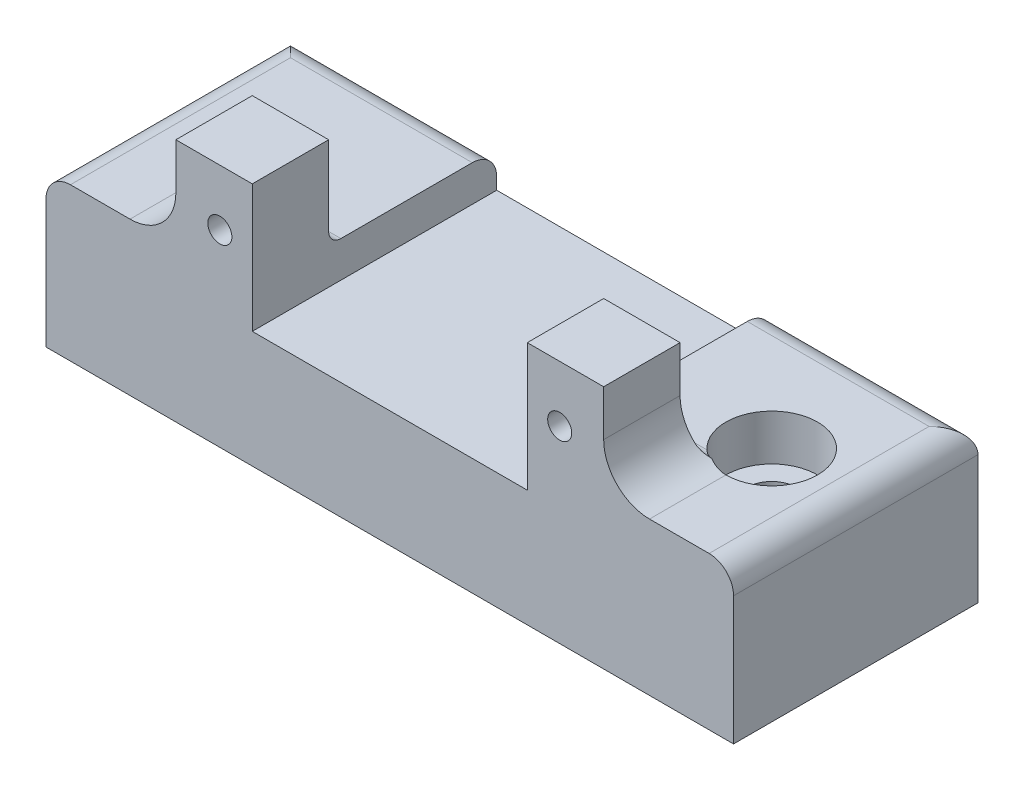
ISO-10303-21;
HEADER;
FILE_DESCRIPTION(('STEP AP214'),'2;1');
FILE_NAME('part.step','',(''),(''),'','','');
FILE_SCHEMA(('AUTOMOTIVE_DESIGN { 1 0 10303 214 1 1 1 1 }'));
ENDSEC;
DATA;
#1=APPLICATION_CONTEXT('core data for automotive mechanical design processes');
#2=APPLICATION_PROTOCOL_DEFINITION('international standard','automotive_design',2000,#1);
#3=PRODUCT_CONTEXT('',#1,'mechanical');
#4=PRODUCT('Part','Part','',(#3));
#5=PRODUCT_RELATED_PRODUCT_CATEGORY('part','',(#4));
#6=PRODUCT_DEFINITION_FORMATION('','',#4);
#7=PRODUCT_DEFINITION_CONTEXT('part definition',#1,'design');
#8=PRODUCT_DEFINITION('design','',#6,#7);
#9=PRODUCT_DEFINITION_SHAPE('','',#8);
#10=(LENGTH_UNIT() NAMED_UNIT(*) SI_UNIT(.MILLI.,.METRE.));
#11=(NAMED_UNIT(*) PLANE_ANGLE_UNIT() SI_UNIT($,.RADIAN.));
#12=(NAMED_UNIT(*) SI_UNIT($,.STERADIAN.) SOLID_ANGLE_UNIT());
#13=UNCERTAINTY_MEASURE_WITH_UNIT(LENGTH_MEASURE(1.E-05),#10,'distance_accuracy_value','');
#14=(GEOMETRIC_REPRESENTATION_CONTEXT(3) GLOBAL_UNCERTAINTY_ASSIGNED_CONTEXT((#13)) GLOBAL_UNIT_ASSIGNED_CONTEXT((#10,
#11,#12)) REPRESENTATION_CONTEXT('',''));
#15=CARTESIAN_POINT('',(0.,0.,0.));
#16=DIRECTION('',(0.,0.,1.));
#17=DIRECTION('',(1.,0.,0.));
#18=AXIS2_PLACEMENT_3D('',#15,#16,#17);
#19=CARTESIAN_POINT('',(0.,12.7,0.));
#20=DIRECTION('',(0.,1.,0.));
#21=DIRECTION('',(0.,0.,1.));
#22=AXIS2_PLACEMENT_3D('',#19,#20,#21);
#23=PLANE('',#22);
#24=CARTESIAN_POINT('',(-21.59,12.7,0.));
#25=DIRECTION('',(0.,1.,0.));
#26=DIRECTION('',(0.,0.,1.));
#27=AXIS2_PLACEMENT_3D('',#24,#25,#26);
#28=CIRCLE('',#27,3.81);
#29=CARTESIAN_POINT('',(-18.9996980870949,12.7,2.794));
#30=VERTEX_POINT('',#29);
#31=CARTESIAN_POINT('',(-21.59,12.7,3.81));
#32=VERTEX_POINT('',#31);
#33=EDGE_CURVE('E260',#30,#32,#28,.T.);
#34=ORIENTED_EDGE('',*,*,#33,.F.);
#35=DIRECTION('',(-1.,0.,0.));
#36=VECTOR('',#35,1.);
#37=CARTESIAN_POINT('',(0.,12.7,2.794));
#38=LINE('',#37,#36);
#39=CARTESIAN_POINT('',(-11.43,12.7,2.794));
#40=VERTEX_POINT('',#39);
#41=EDGE_CURVE('E461',#30,#40,#38,.F.);
#42=ORIENTED_EDGE('',*,*,#41,.T.);
#43=DIRECTION('',(0.,0.,1.));
#44=VECTOR('',#43,1.);
#45=CARTESIAN_POINT('',(-11.43,12.7,-10.161));
#46=LINE('',#45,#44);
#47=CARTESIAN_POINT('',(-11.43,12.7,-8.128));
#48=VERTEX_POINT('',#47);
#49=EDGE_CURVE('E221',#48,#40,#46,.T.);
#50=ORIENTED_EDGE('',*,*,#49,.F.);
#51=DIRECTION('',(-1.,0.,0.));
#52=VECTOR('',#51,1.);
#53=CARTESIAN_POINT('',(-28.575,12.7,-8.128));
#54=LINE('',#53,#52);
#55=CARTESIAN_POINT('',(-26.543,12.7,-8.128));
#56=VERTEX_POINT('',#55);
#57=EDGE_CURVE('E410',#48,#56,#54,.T.);
#58=ORIENTED_EDGE('',*,*,#57,.T.);
#59=DIRECTION('',(0.,0.,1.));
#60=VECTOR('',#59,1.);
#61=CARTESIAN_POINT('',(-26.543,12.7,10.16));
#62=LINE('',#61,#60);
#63=CARTESIAN_POINT('',(-26.543,12.7,10.16));
#64=VERTEX_POINT('',#63);
#65=EDGE_CURVE('E407',#56,#64,#62,.T.);
#66=ORIENTED_EDGE('',*,*,#65,.T.);
#67=DIRECTION('',(1.,0.,0.));
#68=VECTOR('',#67,1.);
#69=CARTESIAN_POINT('',(-28.575,12.7,10.16));
#70=LINE('',#69,#68);
#71=CARTESIAN_POINT('',(-21.59,12.7,10.16));
#72=VERTEX_POINT('',#71);
#73=EDGE_CURVE('E347',#64,#72,#70,.T.);
#74=ORIENTED_EDGE('',*,*,#73,.T.);
#75=DIRECTION('',(0.,0.,1.));
#76=VECTOR('',#75,1.);
#77=CARTESIAN_POINT('',(-21.59,12.7,0.));
#78=LINE('',#77,#76);
#79=EDGE_CURVE('E389',#72,#32,#78,.F.);
#80=ORIENTED_EDGE('',*,*,#79,.T.);
#81=EDGE_LOOP('',(#34,#42,#50,#58,#66,#74,#80));
#82=FACE_BOUND('',#81,.T.);
#83=ADVANCED_FACE('F39',(#82),#23,.T.);
#84=DIRECTION('',(0.,0.,1.));
#85=VECTOR('',#84,1.);
#86=CARTESIAN_POINT('',(11.43,12.7,-10.161));
#87=LINE('',#86,#85);
#88=CARTESIAN_POINT('',(11.43,12.7,-8.128));
#89=VERTEX_POINT('',#88);
#90=CARTESIAN_POINT('',(11.43,12.7,2.794));
#91=VERTEX_POINT('',#90);
#92=EDGE_CURVE('E239',#89,#91,#87,.T.);
#93=ORIENTED_EDGE('',*,*,#92,.T.);
#94=DIRECTION('',(-1.,0.,0.));
#95=VECTOR('',#94,1.);
#96=CARTESIAN_POINT('',(0.,12.7,2.794));
#97=LINE('',#96,#95);
#98=CARTESIAN_POINT('',(18.9996980870949,12.7,2.794));
#99=VERTEX_POINT('',#98);
#100=EDGE_CURVE('E454',#91,#99,#97,.F.);
#101=ORIENTED_EDGE('',*,*,#100,.T.);
#102=CARTESIAN_POINT('',(21.59,12.7,0.));
#103=DIRECTION('',(0.,1.,0.));
#104=DIRECTION('',(0.,0.,1.));
#105=AXIS2_PLACEMENT_3D('',#102,#103,#104);
#106=CIRCLE('',#105,3.81);
#107=CARTESIAN_POINT('',(21.59,12.7,3.81));
#108=VERTEX_POINT('',#107);
#109=EDGE_CURVE('E276',#108,#99,#106,.T.);
#110=ORIENTED_EDGE('',*,*,#109,.F.);
#111=DIRECTION('',(0.,0.,-1.));
#112=VECTOR('',#111,1.);
#113=CARTESIAN_POINT('',(21.59,12.7,0.));
#114=LINE('',#113,#112);
#115=CARTESIAN_POINT('',(21.59,12.7,10.16));
#116=VERTEX_POINT('',#115);
#117=EDGE_CURVE('E382',#108,#116,#114,.F.);
#118=ORIENTED_EDGE('',*,*,#117,.T.);
#119=CARTESIAN_POINT('',(26.543,12.7,10.16));
#120=VERTEX_POINT('',#119);
#121=EDGE_CURVE('E351',#116,#120,#70,.T.);
#122=ORIENTED_EDGE('',*,*,#121,.T.);
#123=DIRECTION('',(0.,0.,-1.));
#124=VECTOR('',#123,1.);
#125=CARTESIAN_POINT('',(26.543,12.7,-10.16));
#126=LINE('',#125,#124);
#127=CARTESIAN_POINT('',(26.543,12.7,-8.128));
#128=VERTEX_POINT('',#127);
#129=EDGE_CURVE('E422',#120,#128,#126,.T.);
#130=ORIENTED_EDGE('',*,*,#129,.T.);
#131=DIRECTION('',(-1.,0.,0.));
#132=VECTOR('',#131,1.);
#133=CARTESIAN_POINT('',(11.43,12.7,-8.128));
#134=LINE('',#133,#132);
#135=EDGE_CURVE('E425',#128,#89,#134,.T.);
#136=ORIENTED_EDGE('',*,*,#135,.T.);
#137=EDGE_LOOP('',(#93,#101,#110,#118,#122,#130,#136));
#138=FACE_BOUND('',#137,.T.);
#139=ADVANCED_FACE('F550',(#138),#23,.T.);
#140=CARTESIAN_POINT('',(-28.575,12.7,-10.16));
#141=DIRECTION('',(1.,0.,0.));
#142=DIRECTION('',(0.,0.,-1.));
#143=AXIS2_PLACEMENT_3D('',#140,#141,#142);
#144=PLANE('',#143);
#145=DIRECTION('',(0.,-1.,0.));
#146=VECTOR('',#145,1.);
#147=CARTESIAN_POINT('',(-28.575,12.7,10.16));
#148=LINE('',#147,#146);
#149=CARTESIAN_POINT('',(-28.575,10.668,10.16));
#150=VERTEX_POINT('',#149);
#151=CARTESIAN_POINT('',(-28.575,0.,10.16));
#152=VERTEX_POINT('',#151);
#153=EDGE_CURVE('E375',#150,#152,#148,.T.);
#154=ORIENTED_EDGE('',*,*,#153,.F.);
#155=DIRECTION('',(0.,0.,1.));
#156=VECTOR('',#155,1.);
#157=CARTESIAN_POINT('',(-28.575,10.668,-10.16));
#158=LINE('',#157,#156);
#159=CARTESIAN_POINT('',(-28.575,10.668,-10.16));
#160=VERTEX_POINT('',#159);
#161=EDGE_CURVE('E441',#150,#160,#158,.F.);
#162=ORIENTED_EDGE('',*,*,#161,.T.);
#163=DIRECTION('',(0.,-1.,0.));
#164=VECTOR('',#163,1.);
#165=CARTESIAN_POINT('',(-28.575,12.7,-10.16));
#166=LINE('',#165,#164);
#167=CARTESIAN_POINT('',(-28.575,0.,-10.16));
#168=VERTEX_POINT('',#167);
#169=EDGE_CURVE('E350',#160,#168,#166,.T.);
#170=ORIENTED_EDGE('',*,*,#169,.T.);
#171=DIRECTION('',(0.,0.,1.));
#172=VECTOR('',#171,1.);
#173=CARTESIAN_POINT('',(-28.575,0.,-10.16));
#174=LINE('',#173,#172);
#175=EDGE_CURVE('E346',#168,#152,#174,.T.);
#176=ORIENTED_EDGE('',*,*,#175,.T.);
#177=EDGE_LOOP('',(#154,#162,#170,#176));
#178=FACE_BOUND('',#177,.T.);
#179=ADVANCED_FACE('F556',(#178),#144,.F.);
#180=CARTESIAN_POINT('',(-28.575,12.7,10.16));
#181=DIRECTION('',(0.,0.,-1.));
#182=DIRECTION('',(-1.,0.,0.));
#183=AXIS2_PLACEMENT_3D('',#180,#181,#182);
#184=PLANE('',#183);
#185=CARTESIAN_POINT('',(-14.125,15.65,10.16));
#186=DIRECTION('',(0.,0.,1.));
#187=DIRECTION('',(1.,0.,0.));
#188=AXIS2_PLACEMENT_3D('',#185,#186,#187);
#189=CIRCLE('',#188,0.999999999999987);
#190=CARTESIAN_POINT('',(-13.125,15.65,10.16));
#191=VERTEX_POINT('',#190);
#192=EDGE_CURVE('E220',#191,#191,#189,.T.);
#193=ORIENTED_EDGE('',*,*,#192,.F.);
#194=EDGE_LOOP('',(#193));
#195=FACE_BOUND('',#194,.T.);
#196=CARTESIAN_POINT('',(14.125,15.65,10.16));
#197=DIRECTION('',(0.,0.,1.));
#198=DIRECTION('',(1.,0.,0.));
#199=AXIS2_PLACEMENT_3D('',#196,#197,#198);
#200=CIRCLE('',#199,0.999999999999987);
#201=CARTESIAN_POINT('',(15.125,15.65,10.16));
#202=VERTEX_POINT('',#201);
#203=EDGE_CURVE('E252',#202,#202,#200,.T.);
#204=ORIENTED_EDGE('',*,*,#203,.F.);
#205=EDGE_LOOP('',(#204));
#206=FACE_BOUND('',#205,.T.);
#207=DIRECTION('',(0.,-1.,0.));
#208=VECTOR('',#207,1.);
#209=CARTESIAN_POINT('',(28.575,12.7,10.16));
#210=LINE('',#209,#208);
#211=CARTESIAN_POINT('',(28.575,10.668,10.16));
#212=VERTEX_POINT('',#211);
#213=CARTESIAN_POINT('',(28.575,0.,10.16));
#214=VERTEX_POINT('',#213);
#215=EDGE_CURVE('E372',#212,#214,#210,.T.);
#216=ORIENTED_EDGE('',*,*,#215,.F.);
#217=CARTESIAN_POINT('',(26.543,10.668,10.16));
#218=DIRECTION('',(0.,0.,-1.));
#219=DIRECTION('',(-1.,0.,0.));
#220=AXIS2_PLACEMENT_3D('',#217,#218,#219);
#221=CIRCLE('',#220,2.032);
#222=EDGE_CURVE('E438',#212,#120,#221,.F.);
#223=ORIENTED_EDGE('',*,*,#222,.T.);
#224=ORIENTED_EDGE('',*,*,#121,.F.);
#225=CARTESIAN_POINT('',(21.59,16.51,10.16));
#226=DIRECTION('',(0.,0.,-1.));
#227=DIRECTION('',(-1.,0.,0.));
#228=AXIS2_PLACEMENT_3D('',#225,#226,#227);
#229=CIRCLE('',#228,3.81);
#230=CARTESIAN_POINT('',(17.78,16.51,10.16));
#231=VERTEX_POINT('',#230);
#232=EDGE_CURVE('E397',#116,#231,#229,.T.);
#233=ORIENTED_EDGE('',*,*,#232,.T.);
#234=DIRECTION('',(0.,-1.,0.));
#235=VECTOR('',#234,1.);
#236=CARTESIAN_POINT('',(17.78,20.32,10.16));
#237=LINE('',#236,#235);
#238=CARTESIAN_POINT('',(17.78,20.32,10.16));
#239=VERTEX_POINT('',#238);
#240=EDGE_CURVE('E312',#239,#231,#237,.T.);
#241=ORIENTED_EDGE('',*,*,#240,.F.);
#242=DIRECTION('',(1.,0.,0.));
#243=VECTOR('',#242,1.);
#244=CARTESIAN_POINT('',(11.43,20.32,10.16));
#245=LINE('',#244,#243);
#246=CARTESIAN_POINT('',(11.43,20.32,10.16));
#247=VERTEX_POINT('',#246);
#248=EDGE_CURVE('E295',#247,#239,#245,.T.);
#249=ORIENTED_EDGE('',*,*,#248,.F.);
#250=DIRECTION('',(0.,-1.,0.));
#251=VECTOR('',#250,1.);
#252=CARTESIAN_POINT('',(11.43,20.32,10.16));
#253=LINE('',#252,#251);
#254=CARTESIAN_POINT('',(11.43,9.7,10.16));
#255=VERTEX_POINT('',#254);
#256=EDGE_CURVE('E316',#247,#255,#253,.T.);
#257=ORIENTED_EDGE('',*,*,#256,.T.);
#258=DIRECTION('',(1.,0.,0.));
#259=VECTOR('',#258,1.);
#260=CARTESIAN_POINT('',(-11.43,9.7,10.16));
#261=LINE('',#260,#259);
#262=CARTESIAN_POINT('',(-11.43,9.7,10.16));
#263=VERTEX_POINT('',#262);
#264=EDGE_CURVE('E210',#263,#255,#261,.T.);
#265=ORIENTED_EDGE('',*,*,#264,.F.);
#266=DIRECTION('',(0.,-1.,0.));
#267=VECTOR('',#266,1.);
#268=CARTESIAN_POINT('',(-11.43,20.32,10.16));
#269=LINE('',#268,#267);
#270=CARTESIAN_POINT('',(-11.43,20.32,10.16));
#271=VERTEX_POINT('',#270);
#272=EDGE_CURVE('E204',#271,#263,#269,.T.);
#273=ORIENTED_EDGE('',*,*,#272,.F.);
#274=DIRECTION('',(1.,0.,0.));
#275=VECTOR('',#274,1.);
#276=CARTESIAN_POINT('',(-11.43,20.32,10.16));
#277=LINE('',#276,#275);
#278=CARTESIAN_POINT('',(-17.78,20.32,10.16));
#279=VERTEX_POINT('',#278);
#280=EDGE_CURVE('E329',#279,#271,#277,.T.);
#281=ORIENTED_EDGE('',*,*,#280,.F.);
#282=DIRECTION('',(0.,-1.,0.));
#283=VECTOR('',#282,1.);
#284=CARTESIAN_POINT('',(-17.78,20.32,10.16));
#285=LINE('',#284,#283);
#286=CARTESIAN_POINT('',(-17.78,16.51,10.16));
#287=VERTEX_POINT('',#286);
#288=EDGE_CURVE('E334',#279,#287,#285,.T.);
#289=ORIENTED_EDGE('',*,*,#288,.T.);
#290=CARTESIAN_POINT('',(-21.59,16.51,10.16));
#291=DIRECTION('',(0.,0.,-1.));
#292=DIRECTION('',(-1.,0.,0.));
#293=AXIS2_PLACEMENT_3D('',#290,#291,#292);
#294=CIRCLE('',#293,3.81);
#295=EDGE_CURVE('E400',#287,#72,#294,.T.);
#296=ORIENTED_EDGE('',*,*,#295,.T.);
#297=ORIENTED_EDGE('',*,*,#73,.F.);
#298=CARTESIAN_POINT('',(-26.543,10.668,10.16));
#299=DIRECTION('',(0.,0.,-1.));
#300=DIRECTION('',(-1.,0.,0.));
#301=AXIS2_PLACEMENT_3D('',#298,#299,#300);
#302=CIRCLE('',#301,2.032);
#303=EDGE_CURVE('E435',#64,#150,#302,.F.);
#304=ORIENTED_EDGE('',*,*,#303,.T.);
#305=ORIENTED_EDGE('',*,*,#153,.T.);
#306=DIRECTION('',(1.,0.,0.));
#307=VECTOR('',#306,1.);
#308=CARTESIAN_POINT('',(-28.575,0.,10.16));
#309=LINE('',#308,#307);
#310=EDGE_CURVE('E355',#152,#214,#309,.T.);
#311=ORIENTED_EDGE('',*,*,#310,.T.);
#312=EDGE_LOOP('',(#216,#223,#224,#233,#241,#249,#257,#265,#273,#281,#289,#296,#297,#304,#305,#311));
#313=FACE_BOUND('',#312,.T.);
#314=ADVANCED_FACE('F571',(#195,#206,#313),#184,.F.);
#315=CARTESIAN_POINT('',(28.575,12.7,-10.16));
#316=DIRECTION('',(-1.,0.,0.));
#317=DIRECTION('',(0.,0.,1.));
#318=AXIS2_PLACEMENT_3D('',#315,#316,#317);
#319=PLANE('',#318);
#320=DIRECTION('',(0.,-1.,0.));
#321=VECTOR('',#320,1.);
#322=CARTESIAN_POINT('',(28.575,12.7,-10.16));
#323=LINE('',#322,#321);
#324=CARTESIAN_POINT('',(28.575,10.668,-10.16));
#325=VERTEX_POINT('',#324);
#326=CARTESIAN_POINT('',(28.575,0.,-10.16));
#327=VERTEX_POINT('',#326);
#328=EDGE_CURVE('E369',#325,#327,#323,.T.);
#329=ORIENTED_EDGE('',*,*,#328,.F.);
#330=DIRECTION('',(0.,0.,-1.));
#331=VECTOR('',#330,1.);
#332=CARTESIAN_POINT('',(28.575,10.668,10.16));
#333=LINE('',#332,#331);
#334=EDGE_CURVE('E432',#325,#212,#333,.F.);
#335=ORIENTED_EDGE('',*,*,#334,.T.);
#336=ORIENTED_EDGE('',*,*,#215,.T.);
#337=DIRECTION('',(0.,0.,-1.));
#338=VECTOR('',#337,1.);
#339=CARTESIAN_POINT('',(28.575,0.,-10.16));
#340=LINE('',#339,#338);
#341=EDGE_CURVE('E359',#214,#327,#340,.T.);
#342=ORIENTED_EDGE('',*,*,#341,.T.);
#343=EDGE_LOOP('',(#329,#335,#336,#342));
#344=FACE_BOUND('',#343,.T.);
#345=ADVANCED_FACE('F568',(#344),#319,.F.);
#346=CARTESIAN_POINT('',(-28.575,12.7,-10.16));
#347=DIRECTION('',(0.,0.,1.));
#348=DIRECTION('',(1.,0.,0.));
#349=AXIS2_PLACEMENT_3D('',#346,#347,#348);
#350=PLANE('',#349);
#351=ORIENTED_EDGE('',*,*,#169,.F.);
#352=DIRECTION('',(-1.,0.,0.));
#353=VECTOR('',#352,1.);
#354=CARTESIAN_POINT('',(-11.43,10.668,-10.16));
#355=LINE('',#354,#353);
#356=CARTESIAN_POINT('',(-11.43,10.668,-10.16));
#357=VERTEX_POINT('',#356);
#358=EDGE_CURVE('E226',#160,#357,#355,.F.);
#359=ORIENTED_EDGE('',*,*,#358,.T.);
#360=DIRECTION('',(0.,1.,0.));
#361=VECTOR('',#360,1.);
#362=CARTESIAN_POINT('',(-11.43,12.7,-10.16));
#363=LINE('',#362,#361);
#364=CARTESIAN_POINT('',(-11.43,9.7,-10.16));
#365=VERTEX_POINT('',#364);
#366=EDGE_CURVE('E200',#365,#357,#363,.T.);
#367=ORIENTED_EDGE('',*,*,#366,.F.);
#368=DIRECTION('',(-1.,0.,0.));
#369=VECTOR('',#368,1.);
#370=CARTESIAN_POINT('',(-11.43,9.7,-10.16));
#371=LINE('',#370,#369);
#372=CARTESIAN_POINT('',(11.43,9.7,-10.16));
#373=VERTEX_POINT('',#372);
#374=EDGE_CURVE('E214',#373,#365,#371,.T.);
#375=ORIENTED_EDGE('',*,*,#374,.F.);
#376=DIRECTION('',(0.,-1.,0.));
#377=VECTOR('',#376,1.);
#378=CARTESIAN_POINT('',(11.43,12.7,-10.16));
#379=LINE('',#378,#377);
#380=CARTESIAN_POINT('',(11.43,10.668,-10.16));
#381=VERTEX_POINT('',#380);
#382=EDGE_CURVE('E228',#381,#373,#379,.T.);
#383=ORIENTED_EDGE('',*,*,#382,.F.);
#384=DIRECTION('',(-1.,0.,0.));
#385=VECTOR('',#384,1.);
#386=CARTESIAN_POINT('',(28.575,10.668,-10.16));
#387=LINE('',#386,#385);
#388=EDGE_CURVE('E414',#381,#325,#387,.F.);
#389=ORIENTED_EDGE('',*,*,#388,.T.);
#390=ORIENTED_EDGE('',*,*,#328,.T.);
#391=DIRECTION('',(-1.,0.,0.));
#392=VECTOR('',#391,1.);
#393=CARTESIAN_POINT('',(-28.575,0.,-10.16));
#394=LINE('',#393,#392);
#395=EDGE_CURVE('E363',#327,#168,#394,.T.);
#396=ORIENTED_EDGE('',*,*,#395,.T.);
#397=EDGE_LOOP('',(#351,#359,#367,#375,#383,#389,#390,#396));
#398=FACE_BOUND('',#397,.T.);
#399=ADVANCED_FACE('F224',(#398),#350,.F.);
#400=CARTESIAN_POINT('',(0.,0.,0.));
#401=DIRECTION('',(0.,1.,0.));
#402=DIRECTION('',(0.,0.,1.));
#403=AXIS2_PLACEMENT_3D('',#400,#401,#402);
#404=PLANE('',#403);
#405=CARTESIAN_POINT('',(-21.59,0.,0.));
#406=DIRECTION('',(0.,1.,0.));
#407=DIRECTION('',(0.,0.,1.));
#408=AXIS2_PLACEMENT_3D('',#405,#406,#407);
#409=CIRCLE('',#408,2.032);
#410=CARTESIAN_POINT('',(-21.59,0.,2.032));
#411=VERTEX_POINT('',#410);
#412=EDGE_CURVE('E272',#411,#411,#409,.T.);
#413=ORIENTED_EDGE('',*,*,#412,.T.);
#414=EDGE_LOOP('',(#413));
#415=FACE_BOUND('',#414,.T.);
#416=CARTESIAN_POINT('',(21.59,0.,0.));
#417=DIRECTION('',(0.,1.,0.));
#418=DIRECTION('',(0.,0.,1.));
#419=AXIS2_PLACEMENT_3D('',#416,#417,#418);
#420=CIRCLE('',#419,2.032);
#421=CARTESIAN_POINT('',(21.59,0.,2.032));
#422=VERTEX_POINT('',#421);
#423=EDGE_CURVE('E287',#422,#422,#420,.T.);
#424=ORIENTED_EDGE('',*,*,#423,.T.);
#425=EDGE_LOOP('',(#424));
#426=FACE_BOUND('',#425,.T.);
#427=ORIENTED_EDGE('',*,*,#175,.F.);
#428=ORIENTED_EDGE('',*,*,#395,.F.);
#429=ORIENTED_EDGE('',*,*,#341,.F.);
#430=ORIENTED_EDGE('',*,*,#310,.F.);
#431=EDGE_LOOP('',(#427,#428,#429,#430));
#432=FACE_BOUND('',#431,.T.);
#433=ADVANCED_FACE('F562',(#415,#426,#432),#404,.F.);
#434=CARTESIAN_POINT('',(-11.43,20.32,3.81));
#435=DIRECTION('',(-1.,0.,0.));
#436=DIRECTION('',(0.,0.,1.));
#437=AXIS2_PLACEMENT_3D('',#434,#435,#436);
#438=PLANE('',#437);
#439=ORIENTED_EDGE('',*,*,#366,.T.);
#440=CARTESIAN_POINT('',(-11.43,10.668,-8.128));
#441=DIRECTION('',(-1.,0.,0.));
#442=DIRECTION('',(0.,0.,1.));
#443=AXIS2_PLACEMENT_3D('',#440,#441,#442);
#444=CIRCLE('',#443,2.032);
#445=EDGE_CURVE('E419',#357,#48,#444,.F.);
#446=ORIENTED_EDGE('',*,*,#445,.T.);
#447=ORIENTED_EDGE('',*,*,#49,.T.);
#448=CARTESIAN_POINT('',(-11.43,13.716,2.794));
#449=DIRECTION('',(-1.,0.,0.));
#450=DIRECTION('',(0.,0.,1.));
#451=AXIS2_PLACEMENT_3D('',#448,#449,#450);
#452=CIRCLE('',#451,1.016);
#453=CARTESIAN_POINT('',(-11.43,13.716,3.81));
#454=VERTEX_POINT('',#453);
#455=EDGE_CURVE('E527',#40,#454,#452,.T.);
#456=ORIENTED_EDGE('',*,*,#455,.T.);
#457=DIRECTION('',(0.,-1.,0.));
#458=VECTOR('',#457,1.);
#459=CARTESIAN_POINT('',(-11.43,20.32,3.81));
#460=LINE('',#459,#458);
#461=CARTESIAN_POINT('',(-11.43,20.32,3.81));
#462=VERTEX_POINT('',#461);
#463=EDGE_CURVE('E342',#462,#454,#460,.T.);
#464=ORIENTED_EDGE('',*,*,#463,.F.);
#465=DIRECTION('',(0.,0.,-1.));
#466=VECTOR('',#465,1.);
#467=CARTESIAN_POINT('',(-11.43,20.32,3.81));
#468=LINE('',#467,#466);
#469=EDGE_CURVE('E319',#271,#462,#468,.T.);
#470=ORIENTED_EDGE('',*,*,#469,.F.);
#471=ORIENTED_EDGE('',*,*,#272,.T.);
#472=DIRECTION('',(0.,0.,1.));
#473=VECTOR('',#472,1.);
#474=CARTESIAN_POINT('',(-11.43,9.7,-10.161));
#475=LINE('',#474,#473);
#476=EDGE_CURVE('E196',#365,#263,#475,.T.);
#477=ORIENTED_EDGE('',*,*,#476,.F.);
#478=EDGE_LOOP('',(#439,#446,#447,#456,#464,#470,#471,#477));
#479=FACE_BOUND('',#478,.T.);
#480=ADVANCED_FACE('F198',(#479),#438,.F.);
#481=CARTESIAN_POINT('',(-11.43,20.32,3.81));
#482=DIRECTION('',(0.,0.,1.));
#483=DIRECTION('',(1.,0.,0.));
#484=AXIS2_PLACEMENT_3D('',#481,#482,#483);
#485=PLANE('',#484);
#486=CARTESIAN_POINT('',(-14.125,15.65,3.81));
#487=DIRECTION('',(0.,0.,1.));
#488=DIRECTION('',(1.,0.,0.));
#489=AXIS2_PLACEMENT_3D('',#486,#487,#488);
#490=CIRCLE('',#489,0.999999999999992);
#491=CARTESIAN_POINT('',(-13.125,15.65,3.81));
#492=VERTEX_POINT('',#491);
#493=EDGE_CURVE('E248',#492,#492,#490,.T.);
#494=ORIENTED_EDGE('',*,*,#493,.T.);
#495=EDGE_LOOP('',(#494));
#496=FACE_BOUND('',#495,.T.);
#497=ORIENTED_EDGE('',*,*,#463,.T.);
#498=DIRECTION('',(-1.,0.,0.));
#499=VECTOR('',#498,1.);
#500=CARTESIAN_POINT('',(-11.43,13.716,3.81));
#501=LINE('',#500,#499);
#502=CARTESIAN_POINT('',(-18.9996980870949,13.716,3.81));
#503=VERTEX_POINT('',#502);
#504=EDGE_CURVE('E457',#454,#503,#501,.T.);
#505=ORIENTED_EDGE('',*,*,#504,.T.);
#506=CARTESIAN_POINT('',(-21.59,16.51,3.81));
#507=DIRECTION('',(0.,0.,1.));
#508=DIRECTION('',(1.,0.,0.));
#509=AXIS2_PLACEMENT_3D('',#506,#507,#508);
#510=CIRCLE('',#509,3.81);
#511=CARTESIAN_POINT('',(-17.78,16.51,3.81));
#512=VERTEX_POINT('',#511);
#513=EDGE_CURVE('E404',#503,#512,#510,.T.);
#514=ORIENTED_EDGE('',*,*,#513,.T.);
#515=DIRECTION('',(0.,-1.,0.));
#516=VECTOR('',#515,1.);
#517=CARTESIAN_POINT('',(-17.78,20.32,3.81));
#518=LINE('',#517,#516);
#519=CARTESIAN_POINT('',(-17.78,20.32,3.81));
#520=VERTEX_POINT('',#519);
#521=EDGE_CURVE('E338',#520,#512,#518,.T.);
#522=ORIENTED_EDGE('',*,*,#521,.F.);
#523=DIRECTION('',(-1.,0.,0.));
#524=VECTOR('',#523,1.);
#525=CARTESIAN_POINT('',(-11.43,20.32,3.81));
#526=LINE('',#525,#524);
#527=EDGE_CURVE('E323',#462,#520,#526,.T.);
#528=ORIENTED_EDGE('',*,*,#527,.F.);
#529=EDGE_LOOP('',(#497,#505,#514,#522,#528));
#530=FACE_BOUND('',#529,.T.);
#531=ADVANCED_FACE('F645',(#496,#530),#485,.F.);
#532=CARTESIAN_POINT('',(-17.78,20.32,3.81));
#533=DIRECTION('',(1.,0.,0.));
#534=DIRECTION('',(0.,0.,-1.));
#535=AXIS2_PLACEMENT_3D('',#532,#533,#534);
#536=PLANE('',#535);
#537=ORIENTED_EDGE('',*,*,#521,.T.);
#538=DIRECTION('',(0.,0.,1.));
#539=VECTOR('',#538,1.);
#540=CARTESIAN_POINT('',(-17.78,16.51,3.81));
#541=LINE('',#540,#539);
#542=EDGE_CURVE('E385',#512,#287,#541,.T.);
#543=ORIENTED_EDGE('',*,*,#542,.T.);
#544=ORIENTED_EDGE('',*,*,#288,.F.);
#545=DIRECTION('',(0.,0.,1.));
#546=VECTOR('',#545,1.);
#547=CARTESIAN_POINT('',(-17.78,20.32,3.81));
#548=LINE('',#547,#546);
#549=EDGE_CURVE('E326',#520,#279,#548,.T.);
#550=ORIENTED_EDGE('',*,*,#549,.F.);
#551=EDGE_LOOP('',(#537,#543,#544,#550));
#552=FACE_BOUND('',#551,.T.);
#553=ADVANCED_FACE('F639',(#552),#536,.F.);
#554=CARTESIAN_POINT('',(0.,20.32,0.));
#555=DIRECTION('',(0.,-1.,0.));
#556=DIRECTION('',(0.,0.,-1.));
#557=AXIS2_PLACEMENT_3D('',#554,#555,#556);
#558=PLANE('',#557);
#559=ORIENTED_EDGE('',*,*,#469,.T.);
#560=ORIENTED_EDGE('',*,*,#527,.T.);
#561=ORIENTED_EDGE('',*,*,#549,.T.);
#562=ORIENTED_EDGE('',*,*,#280,.T.);
#563=EDGE_LOOP('',(#559,#560,#561,#562));
#564=FACE_BOUND('',#563,.T.);
#565=ADVANCED_FACE('F634',(#564),#558,.F.);
#566=CARTESIAN_POINT('',(11.43,20.32,3.81));
#567=DIRECTION('',(1.,0.,0.));
#568=DIRECTION('',(0.,0.,-1.));
#569=AXIS2_PLACEMENT_3D('',#566,#567,#568);
#570=PLANE('',#569);
#571=ORIENTED_EDGE('',*,*,#92,.F.);
#572=CARTESIAN_POINT('',(11.43,10.668,-8.128));
#573=DIRECTION('',(1.,0.,0.));
#574=DIRECTION('',(0.,0.,-1.));
#575=AXIS2_PLACEMENT_3D('',#572,#573,#574);
#576=CIRCLE('',#575,2.032);
#577=EDGE_CURVE('E429',#89,#381,#576,.F.);
#578=ORIENTED_EDGE('',*,*,#577,.T.);
#579=ORIENTED_EDGE('',*,*,#382,.T.);
#580=DIRECTION('',(0.,0.,1.));
#581=VECTOR('',#580,1.);
#582=CARTESIAN_POINT('',(11.43,9.7,-10.161));
#583=LINE('',#582,#581);
#584=EDGE_CURVE('E209',#373,#255,#583,.T.);
#585=ORIENTED_EDGE('',*,*,#584,.T.);
#586=ORIENTED_EDGE('',*,*,#256,.F.);
#587=DIRECTION('',(0.,0.,1.));
#588=VECTOR('',#587,1.);
#589=CARTESIAN_POINT('',(11.43,20.32,3.81));
#590=LINE('',#589,#588);
#591=CARTESIAN_POINT('',(11.43,20.32,3.81));
#592=VERTEX_POINT('',#591);
#593=EDGE_CURVE('E291',#592,#247,#590,.T.);
#594=ORIENTED_EDGE('',*,*,#593,.F.);
#595=DIRECTION('',(0.,-1.,0.));
#596=VECTOR('',#595,1.);
#597=CARTESIAN_POINT('',(11.43,20.32,3.81));
#598=LINE('',#597,#596);
#599=CARTESIAN_POINT('',(11.43,13.716,3.81));
#600=VERTEX_POINT('',#599);
#601=EDGE_CURVE('E304',#592,#600,#598,.T.);
#602=ORIENTED_EDGE('',*,*,#601,.T.);
#603=CARTESIAN_POINT('',(11.43,13.716,2.794));
#604=DIRECTION('',(1.,0.,0.));
#605=DIRECTION('',(0.,0.,-1.));
#606=AXIS2_PLACEMENT_3D('',#603,#604,#605);
#607=CIRCLE('',#606,1.016);
#608=EDGE_CURVE('E464',#600,#91,#607,.T.);
#609=ORIENTED_EDGE('',*,*,#608,.T.);
#610=EDGE_LOOP('',(#571,#578,#579,#585,#586,#594,#602,#609));
#611=FACE_BOUND('',#610,.T.);
#612=ADVANCED_FACE('F616',(#611),#570,.F.);
#613=CARTESIAN_POINT('',(17.78,20.32,3.81));
#614=DIRECTION('',(-1.,0.,0.));
#615=DIRECTION('',(0.,0.,1.));
#616=AXIS2_PLACEMENT_3D('',#613,#614,#615);
#617=PLANE('',#616);
#618=ORIENTED_EDGE('',*,*,#240,.T.);
#619=DIRECTION('',(0.,0.,-1.));
#620=VECTOR('',#619,1.);
#621=CARTESIAN_POINT('',(17.78,16.51,3.81));
#622=LINE('',#621,#620);
#623=CARTESIAN_POINT('',(17.78,16.51,3.81));
#624=VERTEX_POINT('',#623);
#625=EDGE_CURVE('E378',#231,#624,#622,.T.);
#626=ORIENTED_EDGE('',*,*,#625,.T.);
#627=DIRECTION('',(0.,-1.,0.));
#628=VECTOR('',#627,1.);
#629=CARTESIAN_POINT('',(17.78,20.32,3.81));
#630=LINE('',#629,#628);
#631=CARTESIAN_POINT('',(17.78,20.32,3.81));
#632=VERTEX_POINT('',#631);
#633=EDGE_CURVE('E308',#632,#624,#630,.T.);
#634=ORIENTED_EDGE('',*,*,#633,.F.);
#635=DIRECTION('',(0.,0.,-1.));
#636=VECTOR('',#635,1.);
#637=CARTESIAN_POINT('',(17.78,20.32,3.81));
#638=LINE('',#637,#636);
#639=EDGE_CURVE('E298',#239,#632,#638,.T.);
#640=ORIENTED_EDGE('',*,*,#639,.F.);
#641=EDGE_LOOP('',(#618,#626,#634,#640));
#642=FACE_BOUND('',#641,.T.);
#643=ADVANCED_FACE('F625',(#642),#617,.F.);
#644=CARTESIAN_POINT('',(11.43,20.32,3.81));
#645=DIRECTION('',(0.,0.,1.));
#646=DIRECTION('',(1.,0.,0.));
#647=AXIS2_PLACEMENT_3D('',#644,#645,#646);
#648=PLANE('',#647);
#649=CARTESIAN_POINT('',(14.125,15.65,3.81));
#650=DIRECTION('',(0.,0.,1.));
#651=DIRECTION('',(1.,0.,0.));
#652=AXIS2_PLACEMENT_3D('',#649,#650,#651);
#653=CIRCLE('',#652,0.999999999999992);
#654=CARTESIAN_POINT('',(15.125,15.65,3.81));
#655=VERTEX_POINT('',#654);
#656=EDGE_CURVE('E256',#655,#655,#653,.T.);
#657=ORIENTED_EDGE('',*,*,#656,.T.);
#658=EDGE_LOOP('',(#657));
#659=FACE_BOUND('',#658,.T.);
#660=CARTESIAN_POINT('',(21.59,16.51,3.81));
#661=DIRECTION('',(0.,0.,1.));
#662=DIRECTION('',(1.,0.,0.));
#663=AXIS2_PLACEMENT_3D('',#660,#661,#662);
#664=CIRCLE('',#663,3.81);
#665=CARTESIAN_POINT('',(18.9996980870949,13.716,3.81));
#666=VERTEX_POINT('',#665);
#667=EDGE_CURVE('E393',#624,#666,#664,.T.);
#668=ORIENTED_EDGE('',*,*,#667,.T.);
#669=DIRECTION('',(-1.,0.,0.));
#670=VECTOR('',#669,1.);
#671=CARTESIAN_POINT('',(11.43,13.716,3.81));
#672=LINE('',#671,#670);
#673=EDGE_CURVE('E444',#666,#600,#672,.T.);
#674=ORIENTED_EDGE('',*,*,#673,.T.);
#675=ORIENTED_EDGE('',*,*,#601,.F.);
#676=DIRECTION('',(-1.,0.,0.));
#677=VECTOR('',#676,1.);
#678=CARTESIAN_POINT('',(11.43,20.32,3.81));
#679=LINE('',#678,#677);
#680=EDGE_CURVE('E301',#632,#592,#679,.T.);
#681=ORIENTED_EDGE('',*,*,#680,.F.);
#682=ORIENTED_EDGE('',*,*,#633,.T.);
#683=EDGE_LOOP('',(#668,#674,#675,#681,#682));
#684=FACE_BOUND('',#683,.T.);
#685=ADVANCED_FACE('F620',(#659,#684),#648,.F.);
#686=CARTESIAN_POINT('',(0.,20.32,0.));
#687=DIRECTION('',(0.,1.,0.));
#688=DIRECTION('',(0.,0.,1.));
#689=AXIS2_PLACEMENT_3D('',#686,#687,#688);
#690=PLANE('',#689);
#691=ORIENTED_EDGE('',*,*,#593,.T.);
#692=ORIENTED_EDGE('',*,*,#248,.T.);
#693=ORIENTED_EDGE('',*,*,#639,.T.);
#694=ORIENTED_EDGE('',*,*,#680,.T.);
#695=EDGE_LOOP('',(#691,#692,#693,#694));
#696=FACE_BOUND('',#695,.T.);
#697=ADVANCED_FACE('F631',(#696),#690,.T.);
#698=CARTESIAN_POINT('',(21.59,12.7,0.));
#699=DIRECTION('',(0.,1.,0.));
#700=DIRECTION('',(0.,0.,1.));
#701=AXIS2_PLACEMENT_3D('',#698,#699,#700);
#702=CYLINDRICAL_SURFACE('',#701,2.032);
#703=ORIENTED_EDGE('',*,*,#423,.F.);
#704=EDGE_LOOP('',(#703));
#705=FACE_BOUND('',#704,.T.);
#706=CARTESIAN_POINT('',(21.59,8.89,0.));
#707=DIRECTION('',(0.,1.,0.));
#708=DIRECTION('',(0.,0.,1.));
#709=AXIS2_PLACEMENT_3D('',#706,#707,#708);
#710=CIRCLE('',#709,2.032);
#711=CARTESIAN_POINT('',(21.59,8.89,2.032));
#712=VERTEX_POINT('',#711);
#713=EDGE_CURVE('E283',#712,#712,#710,.T.);
#714=ORIENTED_EDGE('',*,*,#713,.T.);
#715=EDGE_LOOP('',(#714));
#716=FACE_BOUND('',#715,.T.);
#717=ADVANCED_FACE('F665',(#705,#716),#702,.F.);
#718=CARTESIAN_POINT('',(23.622,8.89,0.));
#719=DIRECTION('',(0.,-1.,0.));
#720=DIRECTION('',(0.,0.,-1.));
#721=AXIS2_PLACEMENT_3D('',#718,#719,#720);
#722=PLANE('',#721);
#723=ORIENTED_EDGE('',*,*,#713,.F.);
#724=EDGE_LOOP('',(#723));
#725=FACE_BOUND('',#724,.T.);
#726=CARTESIAN_POINT('',(21.59,8.89,0.));
#727=DIRECTION('',(0.,1.,0.));
#728=DIRECTION('',(0.,0.,1.));
#729=AXIS2_PLACEMENT_3D('',#726,#727,#728);
#730=CIRCLE('',#729,3.81);
#731=CARTESIAN_POINT('',(21.59,8.89,3.81));
#732=VERTEX_POINT('',#731);
#733=EDGE_CURVE('E279',#732,#732,#730,.T.);
#734=ORIENTED_EDGE('',*,*,#733,.T.);
#735=EDGE_LOOP('',(#734));
#736=FACE_BOUND('',#735,.T.);
#737=ADVANCED_FACE('F545',(#725,#736),#722,.F.);
#738=CARTESIAN_POINT('',(21.59,12.7,0.));
#739=DIRECTION('',(0.,1.,0.));
#740=DIRECTION('',(0.,0.,1.));
#741=AXIS2_PLACEMENT_3D('',#738,#739,#740);
#742=CYLINDRICAL_SURFACE('',#741,3.81);
#743=ORIENTED_EDGE('',*,*,#733,.F.);
#744=EDGE_LOOP('',(#743));
#745=FACE_BOUND('',#744,.T.);
#746=ORIENTED_EDGE('',*,*,#109,.T.);
#747=CARTESIAN_POINT('',(18.9996980870949,12.7,2.794));
#748=CARTESIAN_POINT('',(19.0458101846227,12.700019467595,2.83676361100579));
#749=CARTESIAN_POINT('',(19.0929476886113,12.7026974434547,2.87832853236598));
#750=CARTESIAN_POINT('',(19.1888552111258,12.7126322473144,2.95879963527534));
#751=CARTESIAN_POINT('',(19.237622407334,12.7198815120534,2.99771009105974));
#752=CARTESIAN_POINT('',(19.335735039951,12.7380790177471,3.07215359323353));
#753=CARTESIAN_POINT('',(19.385058775602,12.7489662845173,3.10773068169287));
#754=CARTESIAN_POINT('',(19.4848041483727,12.7739034709136,3.17614697361065));
#755=CARTESIAN_POINT('',(19.5352261813489,12.7879545484894,3.2089851685928));
#756=CARTESIAN_POINT('',(19.6713948376306,12.8291433245258,3.29319083529177));
#757=CARTESIAN_POINT('',(19.7579668032612,12.8587043375411,3.34206804925034));
#758=CARTESIAN_POINT('',(19.8897330043093,12.907504204822,3.40993888651034));
#759=CARTESIAN_POINT('',(19.9342869320342,12.9246478367559,3.4317862701142));
#760=CARTESIAN_POINT('',(20.0237870148722,12.9602051939231,3.47354446125864));
#761=CARTESIAN_POINT('',(20.0687331186789,12.9786187551312,3.49345551809923));
#762=CARTESIAN_POINT('',(20.1138555952627,12.9975795103145,3.51242048968553));
#763=B_SPLINE_CURVE_WITH_KNOTS('',3,(#747,#748,#749,#750,#751,#752,#753,#754,#755,#756,#757,
#758,#759,#760,#761,#762),.UNSPECIFIED.,.F.,.F.,(4,2,2,2,2,2,2,4),(0.,0.188501661835041,
0.376692260416196,0.561874933137541,0.747125492905236,1.05767544905304,1.21513628807199,
1.37257682726095),.UNSPECIFIED.);
#764=CARTESIAN_POINT('',(20.1138555952627,12.9975795103145,3.51242048968553));
#765=VERTEX_POINT('',#764);
#766=EDGE_CURVE('E63',#99,#765,#763,.T.);
#767=ORIENTED_EDGE('',*,*,#766,.T.);
#768=CARTESIAN_POINT('',(21.59,16.51,0.));
#769=DIRECTION('',(0.,-0.707106781186547,-0.707106781186547));
#770=DIRECTION('',(0.,0.707106781186547,-0.707106781186547));
#771=AXIS2_PLACEMENT_3D('',#768,#769,#770);
#772=ELLIPSE('',#771,5.38815367264149,3.81);
#773=EDGE_CURVE('E49',#108,#765,#772,.T.);
#774=ORIENTED_EDGE('',*,*,#773,.F.);
#775=EDGE_LOOP('',(#746,#767,#774));
#776=FACE_BOUND('',#775,.T.);
#777=ADVANCED_FACE('F481',(#745,#776),#742,.F.);
#778=CARTESIAN_POINT('',(-21.59,12.7,0.));
#779=DIRECTION('',(0.,1.,0.));
#780=DIRECTION('',(0.,0.,1.));
#781=AXIS2_PLACEMENT_3D('',#778,#779,#780);
#782=CYLINDRICAL_SURFACE('',#781,2.032);
#783=ORIENTED_EDGE('',*,*,#412,.F.);
#784=EDGE_LOOP('',(#783));
#785=FACE_BOUND('',#784,.T.);
#786=CARTESIAN_POINT('',(-21.59,8.89,0.));
#787=DIRECTION('',(0.,1.,0.));
#788=DIRECTION('',(0.,0.,1.));
#789=AXIS2_PLACEMENT_3D('',#786,#787,#788);
#790=CIRCLE('',#789,2.032);
#791=CARTESIAN_POINT('',(-21.59,8.89,2.032));
#792=VERTEX_POINT('',#791);
#793=EDGE_CURVE('E268',#792,#792,#790,.T.);
#794=ORIENTED_EDGE('',*,*,#793,.T.);
#795=EDGE_LOOP('',(#794));
#796=FACE_BOUND('',#795,.T.);
#797=ADVANCED_FACE('F538',(#785,#796),#782,.F.);
#798=CARTESIAN_POINT('',(-19.558,8.89,0.));
#799=DIRECTION('',(0.,-1.,0.));
#800=DIRECTION('',(0.,0.,-1.));
#801=AXIS2_PLACEMENT_3D('',#798,#799,#800);
#802=PLANE('',#801);
#803=ORIENTED_EDGE('',*,*,#793,.F.);
#804=EDGE_LOOP('',(#803));
#805=FACE_BOUND('',#804,.T.);
#806=CARTESIAN_POINT('',(-21.59,8.89,0.));
#807=DIRECTION('',(0.,1.,0.));
#808=DIRECTION('',(0.,0.,1.));
#809=AXIS2_PLACEMENT_3D('',#806,#807,#808);
#810=CIRCLE('',#809,3.81);
#811=CARTESIAN_POINT('',(-21.59,8.89,3.81));
#812=VERTEX_POINT('',#811);
#813=EDGE_CURVE('E264',#812,#812,#810,.T.);
#814=ORIENTED_EDGE('',*,*,#813,.T.);
#815=EDGE_LOOP('',(#814));
#816=FACE_BOUND('',#815,.T.);
#817=ADVANCED_FACE('F534',(#805,#816),#802,.F.);
#818=CARTESIAN_POINT('',(-21.59,12.7,0.));
#819=DIRECTION('',(0.,1.,0.));
#820=DIRECTION('',(0.,0.,1.));
#821=AXIS2_PLACEMENT_3D('',#818,#819,#820);
#822=CYLINDRICAL_SURFACE('',#821,3.81);
#823=ORIENTED_EDGE('',*,*,#813,.F.);
#824=EDGE_LOOP('',(#823));
#825=FACE_BOUND('',#824,.T.);
#826=ORIENTED_EDGE('',*,*,#33,.T.);
#827=CARTESIAN_POINT('',(-21.59,16.51,0.));
#828=DIRECTION('',(0.,0.707106781186547,0.707106781186547));
#829=DIRECTION('',(0.,0.707106781186547,-0.707106781186547));
#830=AXIS2_PLACEMENT_3D('',#827,#828,#829);
#831=ELLIPSE('',#830,5.38815367264149,3.81);
#832=CARTESIAN_POINT('',(-20.1138555952627,12.9975795103145,3.51242048968553));
#833=VERTEX_POINT('',#832);
#834=EDGE_CURVE('E11',#32,#833,#831,.T.);
#835=ORIENTED_EDGE('',*,*,#834,.T.);
#836=CARTESIAN_POINT('',(-20.1138555952627,12.9975795103145,3.51242048968553));
#837=CARTESIAN_POINT('',(-20.0389904619875,12.9661453821743,3.48095704453265));
#838=CARTESIAN_POINT('',(-19.964556155079,12.9361547083571,3.44685856313475));
#839=CARTESIAN_POINT('',(-19.8166476322036,12.8799347704468,3.37315495595542));
#840=CARTESIAN_POINT('',(-19.7431777587845,12.8537192270803,3.33353072487118));
#841=CARTESIAN_POINT('',(-19.5997247333454,12.8067800240087,3.24986411372422));
#842=CARTESIAN_POINT('',(-19.5297006033492,12.7859311601683,3.20596360637283));
#843=CARTESIAN_POINT('',(-19.3917466992902,12.7500899055951,3.11298638257891));
#844=CARTESIAN_POINT('',(-19.3238134845072,12.7350873610083,3.06391883026644));
#845=CARTESIAN_POINT('',(-19.2131463403437,12.7162295740664,2.97821597707495));
#846=CARTESIAN_POINT('',(-19.1696667042842,12.7103199804155,2.94299494038259));
#847=CARTESIAN_POINT('',(-19.0837384092253,12.7021954534652,2.87018519245884));
#848=CARTESIAN_POINT('',(-19.0413017923284,12.7000126457924,2.83257876388638));
#849=CARTESIAN_POINT('',(-18.9996980870949,12.7,2.794));
#850=B_SPLINE_CURVE_WITH_KNOTS('',3,(#836,#837,#838,#839,#840,#841,#842,#843,#844,#845,#846,
#847,#848,#849),.UNSPECIFIED.,.F.,.F.,(4,2,2,2,2,2,4),(0.,0.261278669354466,0.523484205083384,
0.778863702817877,1.0337976607457,1.20243266287224,1.37251412674366),.UNSPECIFIED.);
#851=EDGE_CURVE('E519',#833,#30,#850,.T.);
#852=ORIENTED_EDGE('',*,*,#851,.T.);
#853=EDGE_LOOP('',(#826,#835,#852));
#854=FACE_BOUND('',#853,.T.);
#855=ADVANCED_FACE('F528',(#825,#854),#822,.F.);
#856=CARTESIAN_POINT('',(14.125,15.65,10.16));
#857=DIRECTION('',(0.,0.,1.));
#858=DIRECTION('',(1.,0.,0.));
#859=AXIS2_PLACEMENT_3D('',#856,#857,#858);
#860=CYLINDRICAL_SURFACE('',#859,0.999999999999992);
#861=ORIENTED_EDGE('',*,*,#203,.T.);
#862=EDGE_LOOP('',(#861));
#863=FACE_BOUND('',#862,.T.);
#864=ORIENTED_EDGE('',*,*,#656,.F.);
#865=EDGE_LOOP('',(#864));
#866=FACE_BOUND('',#865,.T.);
#867=ADVANCED_FACE('F533',(#863,#866),#860,.F.);
#868=CARTESIAN_POINT('',(-14.125,15.65,10.16));
#869=DIRECTION('',(0.,0.,1.));
#870=DIRECTION('',(1.,0.,0.));
#871=AXIS2_PLACEMENT_3D('',#868,#869,#870);
#872=CYLINDRICAL_SURFACE('',#871,0.999999999999992);
#873=ORIENTED_EDGE('',*,*,#192,.T.);
#874=EDGE_LOOP('',(#873));
#875=FACE_BOUND('',#874,.T.);
#876=ORIENTED_EDGE('',*,*,#493,.F.);
#877=EDGE_LOOP('',(#876));
#878=FACE_BOUND('',#877,.T.);
#879=ADVANCED_FACE('F790',(#875,#878),#872,.F.);
#880=CARTESIAN_POINT('',(-11.43,9.7,-10.161));
#881=DIRECTION('',(0.,-1.,0.));
#882=DIRECTION('',(0.,0.,-1.));
#883=AXIS2_PLACEMENT_3D('',#880,#881,#882);
#884=PLANE('',#883);
#885=ORIENTED_EDGE('',*,*,#374,.T.);
#886=ORIENTED_EDGE('',*,*,#476,.T.);
#887=ORIENTED_EDGE('',*,*,#264,.T.);
#888=ORIENTED_EDGE('',*,*,#584,.F.);
#889=EDGE_LOOP('',(#885,#886,#887,#888));
#890=FACE_BOUND('',#889,.T.);
#891=ADVANCED_FACE('F215',(#890),#884,.F.);
#892=CARTESIAN_POINT('',(21.59,16.51,3.81));
#893=DIRECTION('',(0.,0.,-1.));
#894=DIRECTION('',(-1.,0.,0.));
#895=AXIS2_PLACEMENT_3D('',#892,#893,#894);
#896=CYLINDRICAL_SURFACE('',#895,3.81);
#897=ORIENTED_EDGE('',*,*,#232,.F.);
#898=ORIENTED_EDGE('',*,*,#117,.F.);
#899=ORIENTED_EDGE('',*,*,#773,.T.);
#900=CARTESIAN_POINT('',(20.1138555952627,12.9975795103145,3.51242048968553));
#901=CARTESIAN_POINT('',(20.0389904619875,13.0290429554673,3.5438546178257));
#902=CARTESIAN_POINT('',(19.964556155079,13.0631414368653,3.57384529164288));
#903=CARTESIAN_POINT('',(19.8166476322036,13.1368450440446,3.63006522955317));
#904=CARTESIAN_POINT('',(19.7431777587845,13.1764692751288,3.6562807729197));
#905=CARTESIAN_POINT('',(19.5997247333454,13.2601358862758,3.70321997599126));
#906=CARTESIAN_POINT('',(19.5297006033492,13.3040363936272,3.72406883983168));
#907=CARTESIAN_POINT('',(19.3917466992902,13.3970136174211,3.75991009440491));
#908=CARTESIAN_POINT('',(19.3238134845072,13.4460811697336,3.77491263899173));
#909=CARTESIAN_POINT('',(19.2131463403437,13.531784022925,3.79377042593357));
#910=CARTESIAN_POINT('',(19.1696667042842,13.5670050596174,3.79968001958453));
#911=CARTESIAN_POINT('',(19.0837384092253,13.6398148075412,3.80780454653477));
#912=CARTESIAN_POINT('',(19.0413017923284,13.6774212361136,3.80998735420758));
#913=CARTESIAN_POINT('',(18.9996980870949,13.716,3.81));
#914=B_SPLINE_CURVE_WITH_KNOTS('',3,(#900,#901,#902,#903,#904,#905,#906,#907,#908,#909,#910,
#911,#912,#913),.UNSPECIFIED.,.F.,.F.,(4,2,2,2,2,2,4),(0.,0.261278669354466,0.523484205083384,
0.778863702817877,1.0337976607457,1.20243266287224,1.37251412674365),.UNSPECIFIED.);
#915=EDGE_CURVE('E474',#765,#666,#914,.T.);
#916=ORIENTED_EDGE('',*,*,#915,.T.);
#917=ORIENTED_EDGE('',*,*,#667,.F.);
#918=ORIENTED_EDGE('',*,*,#625,.F.);
#919=EDGE_LOOP('',(#897,#898,#899,#916,#917,#918));
#920=FACE_BOUND('',#919,.T.);
#921=ADVANCED_FACE('F510',(#920),#896,.F.);
#922=CARTESIAN_POINT('',(-21.59,16.51,3.81));
#923=DIRECTION('',(0.,0.,1.));
#924=DIRECTION('',(1.,0.,0.));
#925=AXIS2_PLACEMENT_3D('',#922,#923,#924);
#926=CYLINDRICAL_SURFACE('',#925,3.81);
#927=ORIENTED_EDGE('',*,*,#513,.F.);
#928=CARTESIAN_POINT('',(-18.9996980870949,13.716,3.81));
#929=CARTESIAN_POINT('',(-19.0458101846227,13.6732363889942,3.80998053240499));
#930=CARTESIAN_POINT('',(-19.0929476886114,13.631671467634,3.80730255654533));
#931=CARTESIAN_POINT('',(-19.1888552111259,13.5512003647247,3.7973677526856));
#932=CARTESIAN_POINT('',(-19.237622407334,13.5122899089403,3.79011848794664));
#933=CARTESIAN_POINT('',(-19.335735039951,13.4378464067665,3.77192098225292));
#934=CARTESIAN_POINT('',(-19.385058775602,13.4022693183071,3.76103371548273));
#935=CARTESIAN_POINT('',(-19.4848041483727,13.3338530263894,3.7360965290864));
#936=CARTESIAN_POINT('',(-19.5352261813489,13.3010148314072,3.72204545151062));
#937=CARTESIAN_POINT('',(-19.6713948376306,13.2168091647082,3.68085667547422));
#938=CARTESIAN_POINT('',(-19.7579668032612,13.1679319507497,3.65129566245894));
#939=CARTESIAN_POINT('',(-19.8897330043093,13.1000611134897,3.60249579517802));
#940=CARTESIAN_POINT('',(-19.9342869320342,13.0782137298858,3.5853521632441));
#941=CARTESIAN_POINT('',(-20.0237870148722,13.0364555387414,3.54979480607691));
#942=CARTESIAN_POINT('',(-20.0687331186789,13.0165444819008,3.53138124486884));
#943=CARTESIAN_POINT('',(-20.1138555952627,12.9975795103145,3.51242048968553));
#944=B_SPLINE_CURVE_WITH_KNOTS('',3,(#928,#929,#930,#931,#932,#933,#934,#935,#936,#937,#938,
#939,#940,#941,#942,#943),.UNSPECIFIED.,.F.,.F.,(4,2,2,2,2,2,2,4),(0.,0.188501661835043,
0.376692260416198,0.561874933137544,0.747125492905236,1.05767544905303,1.21513628807199,
1.37257682726095),.UNSPECIFIED.);
#945=EDGE_CURVE('E56',#503,#833,#944,.T.);
#946=ORIENTED_EDGE('',*,*,#945,.T.);
#947=ORIENTED_EDGE('',*,*,#834,.F.);
#948=ORIENTED_EDGE('',*,*,#79,.F.);
#949=ORIENTED_EDGE('',*,*,#295,.F.);
#950=ORIENTED_EDGE('',*,*,#542,.F.);
#951=EDGE_LOOP('',(#927,#946,#947,#948,#949,#950));
#952=FACE_BOUND('',#951,.T.);
#953=ADVANCED_FACE('F503',(#952),#926,.F.);
#954=CARTESIAN_POINT('',(-26.543,10.668,0.));
#955=DIRECTION('',(0.,0.,-1.));
#956=DIRECTION('',(-1.,0.,0.));
#957=AXIS2_PLACEMENT_3D('',#954,#955,#956);
#958=CYLINDRICAL_SURFACE('',#957,2.032);
#959=ORIENTED_EDGE('',*,*,#303,.F.);
#960=ORIENTED_EDGE('',*,*,#65,.F.);
#961=CARTESIAN_POINT('',(-26.543,10.668,-8.128));
#962=DIRECTION('',(0.707106781186547,0.,-0.707106781186547));
#963=DIRECTION('',(-0.707106781186547,0.,-0.707106781186547));
#964=AXIS2_PLACEMENT_3D('',#961,#962,#963);
#965=ELLIPSE('',#964,2.87368195874213,2.032);
#966=EDGE_CURVE('E233',#160,#56,#965,.T.);
#967=ORIENTED_EDGE('',*,*,#966,.F.);
#968=ORIENTED_EDGE('',*,*,#161,.F.);
#969=EDGE_LOOP('',(#959,#960,#967,#968));
#970=FACE_BOUND('',#969,.T.);
#971=ADVANCED_FACE('F500',(#970),#958,.T.);
#972=CARTESIAN_POINT('',(0.,10.668,-8.128));
#973=DIRECTION('',(1.,0.,0.));
#974=DIRECTION('',(0.,0.,-1.));
#975=AXIS2_PLACEMENT_3D('',#972,#973,#974);
#976=CYLINDRICAL_SURFACE('',#975,2.032);
#977=ORIENTED_EDGE('',*,*,#445,.F.);
#978=ORIENTED_EDGE('',*,*,#358,.F.);
#979=ORIENTED_EDGE('',*,*,#966,.T.);
#980=ORIENTED_EDGE('',*,*,#57,.F.);
#981=EDGE_LOOP('',(#977,#978,#979,#980));
#982=FACE_BOUND('',#981,.T.);
#983=ADVANCED_FACE('F495',(#982),#976,.T.);
#984=CARTESIAN_POINT('',(26.543,10.668,0.));
#985=DIRECTION('',(0.,0.,1.));
#986=DIRECTION('',(1.,0.,0.));
#987=AXIS2_PLACEMENT_3D('',#984,#985,#986);
#988=CYLINDRICAL_SURFACE('',#987,2.032);
#989=ORIENTED_EDGE('',*,*,#222,.F.);
#990=ORIENTED_EDGE('',*,*,#334,.F.);
#991=CARTESIAN_POINT('',(26.543,10.668,-8.128));
#992=DIRECTION('',(0.707106781186547,0.,0.707106781186547));
#993=DIRECTION('',(-0.707106781186547,0.,0.707106781186547));
#994=AXIS2_PLACEMENT_3D('',#991,#992,#993);
#995=ELLIPSE('',#994,2.87368195874213,2.032);
#996=EDGE_CURVE('E447',#128,#325,#995,.F.);
#997=ORIENTED_EDGE('',*,*,#996,.F.);
#998=ORIENTED_EDGE('',*,*,#129,.F.);
#999=EDGE_LOOP('',(#989,#990,#997,#998));
#1000=FACE_BOUND('',#999,.T.);
#1001=ADVANCED_FACE('F491',(#1000),#988,.T.);
#1002=CARTESIAN_POINT('',(0.,10.668,-8.128));
#1003=DIRECTION('',(1.,0.,0.));
#1004=DIRECTION('',(0.,0.,-1.));
#1005=AXIS2_PLACEMENT_3D('',#1002,#1003,#1004);
#1006=CYLINDRICAL_SURFACE('',#1005,2.032);
#1007=ORIENTED_EDGE('',*,*,#996,.T.);
#1008=ORIENTED_EDGE('',*,*,#388,.F.);
#1009=ORIENTED_EDGE('',*,*,#577,.F.);
#1010=ORIENTED_EDGE('',*,*,#135,.F.);
#1011=EDGE_LOOP('',(#1007,#1008,#1009,#1010));
#1012=FACE_BOUND('',#1011,.T.);
#1013=ADVANCED_FACE('F489',(#1012),#1006,.T.);
#1014=CARTESIAN_POINT('',(11.43,13.716,2.794));
#1015=DIRECTION('',(-1.,0.,0.));
#1016=DIRECTION('',(0.,0.,1.));
#1017=AXIS2_PLACEMENT_3D('',#1014,#1015,#1016);
#1018=CYLINDRICAL_SURFACE('',#1017,1.016);
#1019=ORIENTED_EDGE('',*,*,#766,.F.);
#1020=ORIENTED_EDGE('',*,*,#100,.F.);
#1021=ORIENTED_EDGE('',*,*,#608,.F.);
#1022=ORIENTED_EDGE('',*,*,#673,.F.);
#1023=ORIENTED_EDGE('',*,*,#915,.F.);
#1024=EDGE_LOOP('',(#1019,#1020,#1021,#1022,#1023));
#1025=FACE_BOUND('',#1024,.T.);
#1026=ADVANCED_FACE('F485',(#1025),#1018,.F.);
#1027=CARTESIAN_POINT('',(-11.43,13.716,2.794));
#1028=DIRECTION('',(-1.,0.,0.));
#1029=DIRECTION('',(0.,0.,1.));
#1030=AXIS2_PLACEMENT_3D('',#1027,#1028,#1029);
#1031=CYLINDRICAL_SURFACE('',#1030,1.016);
#1032=ORIENTED_EDGE('',*,*,#455,.F.);
#1033=ORIENTED_EDGE('',*,*,#41,.F.);
#1034=ORIENTED_EDGE('',*,*,#851,.F.);
#1035=ORIENTED_EDGE('',*,*,#945,.F.);
#1036=ORIENTED_EDGE('',*,*,#504,.F.);
#1037=EDGE_LOOP('',(#1032,#1033,#1034,#1035,#1036));
#1038=FACE_BOUND('',#1037,.T.);
#1039=ADVANCED_FACE('F41',(#1038),#1031,.F.);
#1040=CLOSED_SHELL('',(#83,#139,#179,#314,#345,#399,#433,#480,#531,#553,#565,#612,#643,#685,
#697,#717,#737,#777,#797,#817,#855,#867,#879,#891,#921,#953,#971,#983,#1001,#1013,#1026,#1039));
#1041=MANIFOLD_SOLID_BREP('B2',#1040);
#1042=ADVANCED_BREP_SHAPE_REPRESENTATION('',(#18,#1041),#14);
#1043=SHAPE_DEFINITION_REPRESENTATION(#9,#1042);
ENDSEC;
END-ISO-10303-21;
